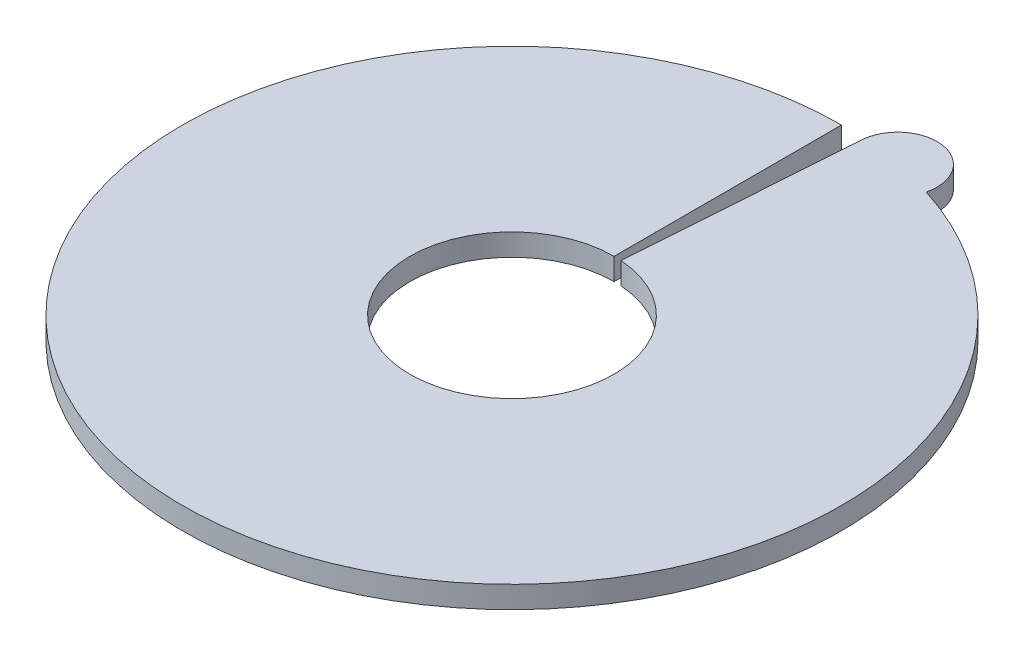
ISO-10303-21;
HEADER;
FILE_DESCRIPTION(('STEP AP214'),'2;1');
FILE_NAME('part.step','',(''),(''),'','','');
FILE_SCHEMA(('AUTOMOTIVE_DESIGN { 1 0 10303 214 1 1 1 1 }'));
ENDSEC;
DATA;
#1=APPLICATION_CONTEXT('core data for automotive mechanical design processes');
#2=APPLICATION_PROTOCOL_DEFINITION('international standard','automotive_design',2000,#1);
#3=PRODUCT_CONTEXT('',#1,'mechanical');
#4=PRODUCT('Part','Part','',(#3));
#5=PRODUCT_RELATED_PRODUCT_CATEGORY('part','',(#4));
#6=PRODUCT_DEFINITION_FORMATION('','',#4);
#7=PRODUCT_DEFINITION_CONTEXT('part definition',#1,'design');
#8=PRODUCT_DEFINITION('design','',#6,#7);
#9=PRODUCT_DEFINITION_SHAPE('','',#8);
#10=(LENGTH_UNIT() NAMED_UNIT(*) SI_UNIT(.MILLI.,.METRE.));
#11=(NAMED_UNIT(*) PLANE_ANGLE_UNIT() SI_UNIT($,.RADIAN.));
#12=(NAMED_UNIT(*) SI_UNIT($,.STERADIAN.) SOLID_ANGLE_UNIT());
#13=UNCERTAINTY_MEASURE_WITH_UNIT(LENGTH_MEASURE(1.E-05),#10,'distance_accuracy_value','');
#14=(GEOMETRIC_REPRESENTATION_CONTEXT(3) GLOBAL_UNCERTAINTY_ASSIGNED_CONTEXT((#13)) GLOBAL_UNIT_ASSIGNED_CONTEXT((#10,
#11,#12)) REPRESENTATION_CONTEXT('',''));
#15=CARTESIAN_POINT('',(0.,0.,0.));
#16=DIRECTION('',(0.,0.,1.));
#17=DIRECTION('',(1.,0.,0.));
#18=AXIS2_PLACEMENT_3D('',#15,#16,#17);
#19=CARTESIAN_POINT('',(2.82991370931536,1.,-14.7306343515081));
#20=DIRECTION('',(0.,-1.,0.));
#21=DIRECTION('',(0.,0.,-1.));
#22=AXIS2_PLACEMENT_3D('',#19,#20,#21);
#23=CYLINDRICAL_SURFACE('',#22,1.79294326418083);
#24=CARTESIAN_POINT('',(2.82991370931536,0.,-14.7306343515081));
#25=DIRECTION('',(0.,-1.,0.));
#26=DIRECTION('',(0.,0.,-1.));
#27=AXIS2_PLACEMENT_3D('',#24,#25,#26);
#28=CIRCLE('',#27,1.79294326418083);
#29=CARTESIAN_POINT('',(1.05209902233217,0.,-14.9630574297905));
#30=VERTEX_POINT('',#29);
#31=CARTESIAN_POINT('',(4.56729653181636,0.,-14.2877500814669));
#32=VERTEX_POINT('',#31);
#33=EDGE_CURVE('E110',#30,#32,#28,.T.);
#34=ORIENTED_EDGE('',*,*,#33,.F.);
#35=DIRECTION('',(0.,-1.,0.));
#36=VECTOR('',#35,1.);
#37=CARTESIAN_POINT('',(1.05209902233217,1.,-14.9630574297905));
#38=LINE('',#37,#36);
#39=CARTESIAN_POINT('',(1.05209902233217,1.,-14.9630574297905));
#40=VERTEX_POINT('',#39);
#41=EDGE_CURVE('E11',#40,#30,#38,.T.);
#42=ORIENTED_EDGE('',*,*,#41,.F.);
#43=CARTESIAN_POINT('',(2.82991370931536,1.,-14.7306343515081));
#44=DIRECTION('',(0.,-1.,0.));
#45=DIRECTION('',(0.,0.,-1.));
#46=AXIS2_PLACEMENT_3D('',#43,#44,#45);
#47=CIRCLE('',#46,1.79294326418083);
#48=CARTESIAN_POINT('',(4.56729653181636,1.,-14.2877500814669));
#49=VERTEX_POINT('',#48);
#50=EDGE_CURVE('E105',#40,#49,#47,.T.);
#51=ORIENTED_EDGE('',*,*,#50,.T.);
#52=DIRECTION('',(0.,-1.,0.));
#53=VECTOR('',#52,1.);
#54=CARTESIAN_POINT('',(4.56729653181636,1.,-14.2877500814669));
#55=LINE('',#54,#53);
#56=EDGE_CURVE('E36',#49,#32,#55,.T.);
#57=ORIENTED_EDGE('',*,*,#56,.T.);
#58=EDGE_LOOP('',(#34,#42,#51,#57));
#59=FACE_BOUND('',#58,.T.);
#60=ADVANCED_FACE('F33',(#59),#23,.T.);
#61=CARTESIAN_POINT('',(0.326150696922972,1.,-4.63854780323505));
#62=DIRECTION('',(-0.997537161986031,0.,-0.0701399348221446));
#63=DIRECTION('',(-0.0701399348221446,0.,0.997537161986031));
#64=AXIS2_PLACEMENT_3D('',#61,#62,#63);
#65=PLANE('',#64);
#66=DIRECTION('',(0.0701399348221446,0.,-0.997537161986031));
#67=VECTOR('',#66,1.);
#68=CARTESIAN_POINT('',(0.326150696922972,0.,-4.63854780323505));
#69=LINE('',#68,#67);
#70=CARTESIAN_POINT('',(0.326150696922977,0.,-4.63854780323505));
#71=VERTEX_POINT('',#70);
#72=EDGE_CURVE('E119',#71,#30,#69,.T.);
#73=ORIENTED_EDGE('',*,*,#72,.F.);
#74=DIRECTION('',(0.,-1.,0.));
#75=VECTOR('',#74,1.);
#76=CARTESIAN_POINT('',(0.326150696922977,1.,-4.63854780323505));
#77=LINE('',#76,#75);
#78=CARTESIAN_POINT('',(0.326150696922977,1.,-4.63854780323505));
#79=VERTEX_POINT('',#78);
#80=EDGE_CURVE('E42',#79,#71,#77,.T.);
#81=ORIENTED_EDGE('',*,*,#80,.F.);
#82=DIRECTION('',(0.0701399348221446,0.,-0.997537161986031));
#83=VECTOR('',#82,1.);
#84=CARTESIAN_POINT('',(0.326150696922972,1.,-4.63854780323505));
#85=LINE('',#84,#83);
#86=EDGE_CURVE('E100',#79,#40,#85,.T.);
#87=ORIENTED_EDGE('',*,*,#86,.T.);
#88=ORIENTED_EDGE('',*,*,#41,.T.);
#89=EDGE_LOOP('',(#73,#81,#87,#88));
#90=FACE_BOUND('',#89,.T.);
#91=ADVANCED_FACE('F125',(#90),#65,.T.);
#92=CARTESIAN_POINT('',(0.,1.,0.));
#93=DIRECTION('',(0.,-1.,0.));
#94=DIRECTION('',(0.,0.,-1.));
#95=AXIS2_PLACEMENT_3D('',#92,#93,#94);
#96=CYLINDRICAL_SURFACE('',#95,4.65);
#97=CARTESIAN_POINT('',(0.,0.,0.));
#98=DIRECTION('',(0.,1.,0.));
#99=DIRECTION('',(0.,0.,1.));
#100=AXIS2_PLACEMENT_3D('',#97,#98,#99);
#101=CIRCLE('',#100,4.65);
#102=CARTESIAN_POINT('',(0.,0.,-4.65));
#103=VERTEX_POINT('',#102);
#104=EDGE_CURVE('E89',#103,#71,#101,.T.);
#105=ORIENTED_EDGE('',*,*,#104,.F.);
#106=DIRECTION('',(0.,-1.,0.));
#107=VECTOR('',#106,1.);
#108=CARTESIAN_POINT('',(0.,1.,-4.65));
#109=LINE('',#108,#107);
#110=CARTESIAN_POINT('',(0.,1.,-4.65));
#111=VERTEX_POINT('',#110);
#112=EDGE_CURVE('E84',#111,#103,#109,.T.);
#113=ORIENTED_EDGE('',*,*,#112,.F.);
#114=CARTESIAN_POINT('',(0.,1.,0.));
#115=DIRECTION('',(0.,1.,0.));
#116=DIRECTION('',(0.,0.,1.));
#117=AXIS2_PLACEMENT_3D('',#114,#115,#116);
#118=CIRCLE('',#117,4.65);
#119=EDGE_CURVE('E87',#111,#79,#118,.T.);
#120=ORIENTED_EDGE('',*,*,#119,.T.);
#121=ORIENTED_EDGE('',*,*,#80,.T.);
#122=EDGE_LOOP('',(#105,#113,#120,#121));
#123=FACE_BOUND('',#122,.T.);
#124=ADVANCED_FACE('F86',(#123),#96,.F.);
#125=CARTESIAN_POINT('',(0.,1.,-15.));
#126=DIRECTION('',(1.,0.,0.));
#127=DIRECTION('',(0.,0.,-1.));
#128=AXIS2_PLACEMENT_3D('',#125,#126,#127);
#129=PLANE('',#128);
#130=DIRECTION('',(0.,0.,1.));
#131=VECTOR('',#130,1.);
#132=CARTESIAN_POINT('',(0.,0.,-15.));
#133=LINE('',#132,#131);
#134=CARTESIAN_POINT('',(0.,0.,-15.));
#135=VERTEX_POINT('',#134);
#136=EDGE_CURVE('E116',#135,#103,#133,.T.);
#137=ORIENTED_EDGE('',*,*,#136,.F.);
#138=DIRECTION('',(0.,-1.,0.));
#139=VECTOR('',#138,1.);
#140=CARTESIAN_POINT('',(0.,1.,-15.));
#141=LINE('',#140,#139);
#142=CARTESIAN_POINT('',(0.,1.,-15.));
#143=VERTEX_POINT('',#142);
#144=EDGE_CURVE('E94',#143,#135,#141,.T.);
#145=ORIENTED_EDGE('',*,*,#144,.F.);
#146=DIRECTION('',(0.,0.,1.));
#147=VECTOR('',#146,1.);
#148=CARTESIAN_POINT('',(0.,1.,-15.));
#149=LINE('',#148,#147);
#150=EDGE_CURVE('E99',#143,#111,#149,.T.);
#151=ORIENTED_EDGE('',*,*,#150,.T.);
#152=ORIENTED_EDGE('',*,*,#112,.T.);
#153=EDGE_LOOP('',(#137,#145,#151,#152));
#154=FACE_BOUND('',#153,.T.);
#155=ADVANCED_FACE('F102',(#154),#129,.T.);
#156=CARTESIAN_POINT('',(0.,1.,0.));
#157=DIRECTION('',(0.,-1.,0.));
#158=DIRECTION('',(0.,0.,-1.));
#159=AXIS2_PLACEMENT_3D('',#156,#157,#158);
#160=CYLINDRICAL_SURFACE('',#159,15.);
#161=CARTESIAN_POINT('',(0.,0.,0.));
#162=DIRECTION('',(0.,-1.,0.));
#163=DIRECTION('',(0.,0.,-1.));
#164=AXIS2_PLACEMENT_3D('',#161,#162,#163);
#165=CIRCLE('',#164,15.);
#166=EDGE_CURVE('E113',#32,#135,#165,.T.);
#167=ORIENTED_EDGE('',*,*,#166,.F.);
#168=ORIENTED_EDGE('',*,*,#56,.F.);
#169=CARTESIAN_POINT('',(0.,1.,0.));
#170=DIRECTION('',(0.,-1.,0.));
#171=DIRECTION('',(0.,0.,-1.));
#172=AXIS2_PLACEMENT_3D('',#169,#170,#171);
#173=CIRCLE('',#172,15.);
#174=EDGE_CURVE('E103',#49,#143,#173,.T.);
#175=ORIENTED_EDGE('',*,*,#174,.T.);
#176=ORIENTED_EDGE('',*,*,#144,.T.);
#177=EDGE_LOOP('',(#167,#168,#175,#176));
#178=FACE_BOUND('',#177,.T.);
#179=ADVANCED_FACE('F122',(#178),#160,.T.);
#180=CARTESIAN_POINT('',(2.82991370931536,1.,-14.7306343515081));
#181=DIRECTION('',(0.,-1.,0.));
#182=DIRECTION('',(0.,0.,-1.));
#183=AXIS2_PLACEMENT_3D('',#180,#181,#182);
#184=PLANE('',#183);
#185=ORIENTED_EDGE('',*,*,#50,.F.);
#186=ORIENTED_EDGE('',*,*,#86,.F.);
#187=ORIENTED_EDGE('',*,*,#119,.F.);
#188=ORIENTED_EDGE('',*,*,#150,.F.);
#189=ORIENTED_EDGE('',*,*,#174,.F.);
#190=EDGE_LOOP('',(#185,#186,#187,#188,#189));
#191=FACE_BOUND('',#190,.T.);
#192=ADVANCED_FACE('F98',(#191),#184,.F.);
#193=CARTESIAN_POINT('',(2.82991370931536,0.,-14.7306343515081));
#194=DIRECTION('',(0.,-1.,0.));
#195=DIRECTION('',(0.,0.,-1.));
#196=AXIS2_PLACEMENT_3D('',#193,#194,#195);
#197=PLANE('',#196);
#198=ORIENTED_EDGE('',*,*,#33,.T.);
#199=ORIENTED_EDGE('',*,*,#166,.T.);
#200=ORIENTED_EDGE('',*,*,#136,.T.);
#201=ORIENTED_EDGE('',*,*,#104,.T.);
#202=ORIENTED_EDGE('',*,*,#72,.T.);
#203=EDGE_LOOP('',(#198,#199,#200,#201,#202));
#204=FACE_BOUND('',#203,.T.);
#205=ADVANCED_FACE('F124',(#204),#197,.T.);
#206=CLOSED_SHELL('',(#60,#91,#124,#155,#179,#192,#205));
#207=MANIFOLD_SOLID_BREP('B2',#206);
#208=ADVANCED_BREP_SHAPE_REPRESENTATION('',(#18,#207),#14);
#209=SHAPE_DEFINITION_REPRESENTATION(#9,#208);
ENDSEC;
END-ISO-10303-21;
